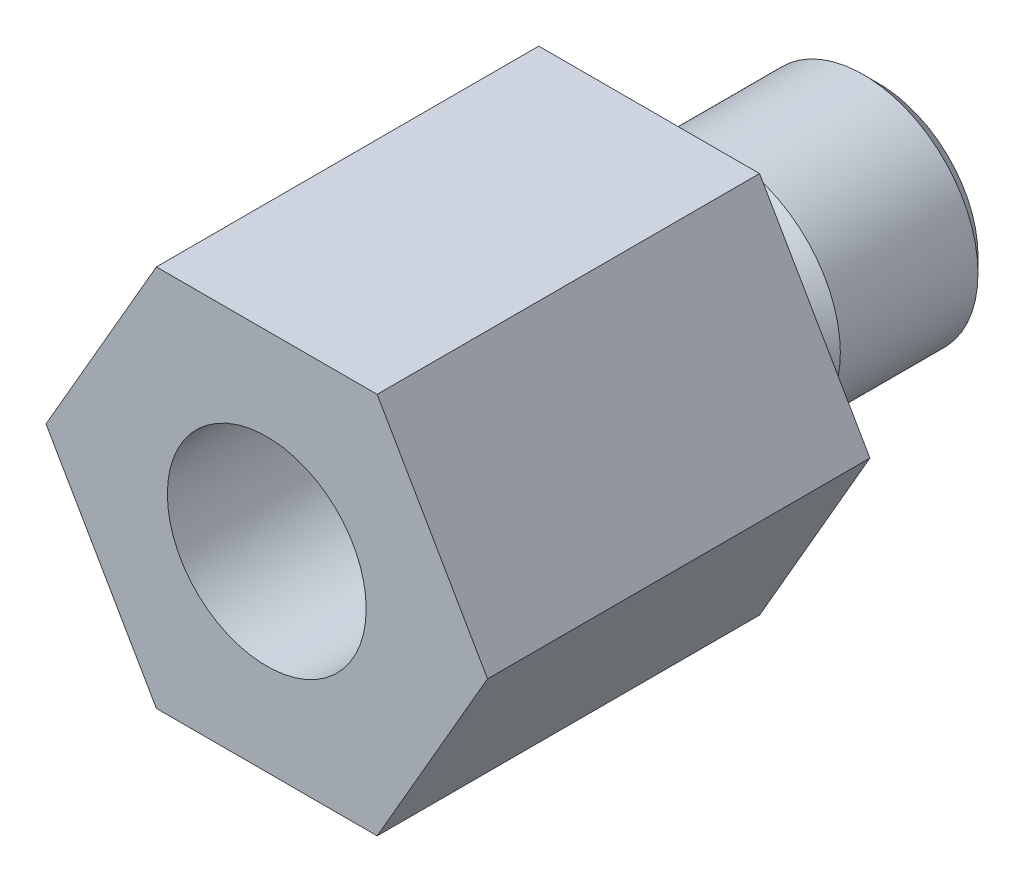
ISO-10303-21;
HEADER;
FILE_DESCRIPTION(('STEP AP214'),'2;1');
FILE_NAME('part.step','',(''),(''),'','','');
FILE_SCHEMA(('AUTOMOTIVE_DESIGN { 1 0 10303 214 1 1 1 1 }'));
ENDSEC;
DATA;
#1=APPLICATION_CONTEXT('core data for automotive mechanical design processes');
#2=APPLICATION_PROTOCOL_DEFINITION('international standard','automotive_design',2000,#1);
#3=PRODUCT_CONTEXT('',#1,'mechanical');
#4=PRODUCT('Part','Part','',(#3));
#5=PRODUCT_RELATED_PRODUCT_CATEGORY('part','',(#4));
#6=PRODUCT_DEFINITION_FORMATION('','',#4);
#7=PRODUCT_DEFINITION_CONTEXT('part definition',#1,'design');
#8=PRODUCT_DEFINITION('design','',#6,#7);
#9=PRODUCT_DEFINITION_SHAPE('','',#8);
#10=(LENGTH_UNIT() NAMED_UNIT(*) SI_UNIT(.MILLI.,.METRE.));
#11=(NAMED_UNIT(*) PLANE_ANGLE_UNIT() SI_UNIT($,.RADIAN.));
#12=(NAMED_UNIT(*) SI_UNIT($,.STERADIAN.) SOLID_ANGLE_UNIT());
#13=UNCERTAINTY_MEASURE_WITH_UNIT(LENGTH_MEASURE(1.E-05),#10,'distance_accuracy_value','');
#14=(GEOMETRIC_REPRESENTATION_CONTEXT(3) GLOBAL_UNCERTAINTY_ASSIGNED_CONTEXT((#13)) GLOBAL_UNIT_ASSIGNED_CONTEXT((#10,
#11,#12)) REPRESENTATION_CONTEXT('',''));
#15=CARTESIAN_POINT('',(0.,0.,0.));
#16=DIRECTION('',(0.,0.,1.));
#17=DIRECTION('',(1.,0.,0.));
#18=AXIS2_PLACEMENT_3D('',#15,#16,#17);
#19=CARTESIAN_POINT('',(1.44337567297406,2.5,0.));
#20=DIRECTION('',(0.,0.,1.));
#21=DIRECTION('',(1.,0.,0.));
#22=AXIS2_PLACEMENT_3D('',#19,#20,#21);
#23=PLANE('',#22);
#24=CARTESIAN_POINT('',(0.,0.,0.));
#25=DIRECTION('',(0.,0.,-1.));
#26=DIRECTION('',(-1.,0.,0.));
#27=AXIS2_PLACEMENT_3D('',#24,#25,#26);
#28=CIRCLE('',#27,1.4);
#29=CARTESIAN_POINT('',(-1.4,0.,0.));
#30=VERTEX_POINT('',#29);
#31=EDGE_CURVE('E320',#30,#30,#28,.T.);
#32=ORIENTED_EDGE('',*,*,#31,.F.);
#33=EDGE_LOOP('',(#32));
#34=FACE_BOUND('',#33,.T.);
#35=DIRECTION('',(-0.5,0.866025403784439,0.));
#36=VECTOR('',#35,1.);
#37=CARTESIAN_POINT('',(2.88675134594812,0.,0.));
#38=LINE('',#37,#36);
#39=CARTESIAN_POINT('',(2.88675134594812,0.,0.));
#40=VERTEX_POINT('',#39);
#41=CARTESIAN_POINT('',(1.44337567297406,2.5,0.));
#42=VERTEX_POINT('',#41);
#43=EDGE_CURVE('E92',#40,#42,#38,.T.);
#44=ORIENTED_EDGE('',*,*,#43,.F.);
#45=DIRECTION('',(0.5,0.866025403784439,0.));
#46=VECTOR('',#45,1.);
#47=CARTESIAN_POINT('',(1.44337567297405,-2.5,0.));
#48=LINE('',#47,#46);
#49=CARTESIAN_POINT('',(1.44337567297405,-2.5,0.));
#50=VERTEX_POINT('',#49);
#51=EDGE_CURVE('E121',#50,#40,#48,.T.);
#52=ORIENTED_EDGE('',*,*,#51,.F.);
#53=DIRECTION('',(1.,0.,0.));
#54=VECTOR('',#53,1.);
#55=CARTESIAN_POINT('',(-1.44337567297407,-2.5,0.));
#56=LINE('',#55,#54);
#57=CARTESIAN_POINT('',(-1.44337567297407,-2.5,0.));
#58=VERTEX_POINT('',#57);
#59=EDGE_CURVE('E119',#58,#50,#56,.T.);
#60=ORIENTED_EDGE('',*,*,#59,.F.);
#61=DIRECTION('',(0.5,-0.866025403784439,0.));
#62=VECTOR('',#61,1.);
#63=CARTESIAN_POINT('',(-2.88675134594813,0.,0.));
#64=LINE('',#63,#62);
#65=CARTESIAN_POINT('',(-2.88675134594813,0.,0.));
#66=VERTEX_POINT('',#65);
#67=EDGE_CURVE('E117',#66,#58,#64,.T.);
#68=ORIENTED_EDGE('',*,*,#67,.F.);
#69=DIRECTION('',(-0.5,-0.866025403784439,0.));
#70=VECTOR('',#69,1.);
#71=CARTESIAN_POINT('',(-1.44337567297407,2.5,0.));
#72=LINE('',#71,#70);
#73=CARTESIAN_POINT('',(-1.44337567297407,2.5,0.));
#74=VERTEX_POINT('',#73);
#75=EDGE_CURVE('E94',#74,#66,#72,.T.);
#76=ORIENTED_EDGE('',*,*,#75,.F.);
#77=DIRECTION('',(-1.,0.,0.));
#78=VECTOR('',#77,1.);
#79=CARTESIAN_POINT('',(1.44337567297406,2.5,0.));
#80=LINE('',#79,#78);
#81=EDGE_CURVE('E88',#42,#74,#80,.T.);
#82=ORIENTED_EDGE('',*,*,#81,.F.);
#83=EDGE_LOOP('',(#44,#52,#60,#68,#76,#82));
#84=FACE_BOUND('',#83,.T.);
#85=ADVANCED_FACE('F34',(#34,#84),#23,.F.);
#86=CARTESIAN_POINT('',(2.88675134594812,0.,5.));
#87=DIRECTION('',(-0.866025403784439,-0.5,0.));
#88=DIRECTION('',(0.5,-0.866025403784439,0.));
#89=AXIS2_PLACEMENT_3D('',#86,#87,#88);
#90=PLANE('',#89);
#91=ORIENTED_EDGE('',*,*,#43,.T.);
#92=DIRECTION('',(0.,0.,-1.));
#93=VECTOR('',#92,1.);
#94=CARTESIAN_POINT('',(1.44337567297406,2.5,5.));
#95=LINE('',#94,#93);
#96=CARTESIAN_POINT('',(1.44337567297406,2.5,5.));
#97=VERTEX_POINT('',#96);
#98=EDGE_CURVE('E100',#97,#42,#95,.T.);
#99=ORIENTED_EDGE('',*,*,#98,.F.);
#100=DIRECTION('',(-0.5,0.866025403784439,0.));
#101=VECTOR('',#100,1.);
#102=CARTESIAN_POINT('',(2.88675134594812,0.,5.));
#103=LINE('',#102,#101);
#104=CARTESIAN_POINT('',(2.88675134594812,0.,5.));
#105=VERTEX_POINT('',#104);
#106=EDGE_CURVE('E123',#105,#97,#103,.T.);
#107=ORIENTED_EDGE('',*,*,#106,.F.);
#108=DIRECTION('',(0.,0.,-1.));
#109=VECTOR('',#108,1.);
#110=CARTESIAN_POINT('',(2.88675134594812,0.,5.));
#111=LINE('',#110,#109);
#112=EDGE_CURVE('E108',#105,#40,#111,.T.);
#113=ORIENTED_EDGE('',*,*,#112,.T.);
#114=EDGE_LOOP('',(#91,#99,#107,#113));
#115=FACE_BOUND('',#114,.T.);
#116=ADVANCED_FACE('F36',(#115),#90,.F.);
#117=CARTESIAN_POINT('',(1.44337567297406,2.5,5.));
#118=DIRECTION('',(0.,-1.,0.));
#119=DIRECTION('',(0.,0.,-1.));
#120=AXIS2_PLACEMENT_3D('',#117,#118,#119);
#121=PLANE('',#120);
#122=ORIENTED_EDGE('',*,*,#81,.T.);
#123=DIRECTION('',(0.,0.,-1.));
#124=VECTOR('',#123,1.);
#125=CARTESIAN_POINT('',(-1.44337567297407,2.5,5.));
#126=LINE('',#125,#124);
#127=CARTESIAN_POINT('',(-1.44337567297407,2.5,5.));
#128=VERTEX_POINT('',#127);
#129=EDGE_CURVE('E105',#128,#74,#126,.T.);
#130=ORIENTED_EDGE('',*,*,#129,.F.);
#131=DIRECTION('',(-1.,0.,0.));
#132=VECTOR('',#131,1.);
#133=CARTESIAN_POINT('',(1.44337567297406,2.5,5.));
#134=LINE('',#133,#132);
#135=EDGE_CURVE('E102',#97,#128,#134,.T.);
#136=ORIENTED_EDGE('',*,*,#135,.F.);
#137=ORIENTED_EDGE('',*,*,#98,.T.);
#138=EDGE_LOOP('',(#122,#130,#136,#137));
#139=FACE_BOUND('',#138,.T.);
#140=ADVANCED_FACE('F101',(#139),#121,.F.);
#141=CARTESIAN_POINT('',(-1.44337567297407,2.5,5.));
#142=DIRECTION('',(0.866025403784439,-0.5,0.));
#143=DIRECTION('',(0.5,0.866025403784439,0.));
#144=AXIS2_PLACEMENT_3D('',#141,#142,#143);
#145=PLANE('',#144);
#146=ORIENTED_EDGE('',*,*,#75,.T.);
#147=DIRECTION('',(0.,0.,-1.));
#148=VECTOR('',#147,1.);
#149=CARTESIAN_POINT('',(-2.88675134594813,0.,5.));
#150=LINE('',#149,#148);
#151=CARTESIAN_POINT('',(-2.88675134594813,0.,5.));
#152=VERTEX_POINT('',#151);
#153=EDGE_CURVE('E139',#152,#66,#150,.T.);
#154=ORIENTED_EDGE('',*,*,#153,.F.);
#155=DIRECTION('',(-0.5,-0.866025403784439,0.));
#156=VECTOR('',#155,1.);
#157=CARTESIAN_POINT('',(-1.44337567297407,2.5,5.));
#158=LINE('',#157,#156);
#159=EDGE_CURVE('E126',#128,#152,#158,.T.);
#160=ORIENTED_EDGE('',*,*,#159,.F.);
#161=ORIENTED_EDGE('',*,*,#129,.T.);
#162=EDGE_LOOP('',(#146,#154,#160,#161));
#163=FACE_BOUND('',#162,.T.);
#164=ADVANCED_FACE('F187',(#163),#145,.F.);
#165=CARTESIAN_POINT('',(-2.88675134594813,0.,5.));
#166=DIRECTION('',(0.866025403784439,0.5,0.));
#167=DIRECTION('',(-0.5,0.866025403784439,0.));
#168=AXIS2_PLACEMENT_3D('',#165,#166,#167);
#169=PLANE('',#168);
#170=ORIENTED_EDGE('',*,*,#67,.T.);
#171=DIRECTION('',(0.,0.,-1.));
#172=VECTOR('',#171,1.);
#173=CARTESIAN_POINT('',(-1.44337567297407,-2.5,5.));
#174=LINE('',#173,#172);
#175=CARTESIAN_POINT('',(-1.44337567297407,-2.5,5.));
#176=VERTEX_POINT('',#175);
#177=EDGE_CURVE('E136',#176,#58,#174,.T.);
#178=ORIENTED_EDGE('',*,*,#177,.F.);
#179=DIRECTION('',(0.5,-0.866025403784439,0.));
#180=VECTOR('',#179,1.);
#181=CARTESIAN_POINT('',(-2.88675134594813,0.,5.));
#182=LINE('',#181,#180);
#183=EDGE_CURVE('E128',#152,#176,#182,.T.);
#184=ORIENTED_EDGE('',*,*,#183,.F.);
#185=ORIENTED_EDGE('',*,*,#153,.T.);
#186=EDGE_LOOP('',(#170,#178,#184,#185));
#187=FACE_BOUND('',#186,.T.);
#188=ADVANCED_FACE('F183',(#187),#169,.F.);
#189=CARTESIAN_POINT('',(-1.44337567297407,-2.5,5.));
#190=DIRECTION('',(0.,1.,0.));
#191=DIRECTION('',(0.,0.,1.));
#192=AXIS2_PLACEMENT_3D('',#189,#190,#191);
#193=PLANE('',#192);
#194=ORIENTED_EDGE('',*,*,#59,.T.);
#195=DIRECTION('',(0.,0.,-1.));
#196=VECTOR('',#195,1.);
#197=CARTESIAN_POINT('',(1.44337567297405,-2.5,5.));
#198=LINE('',#197,#196);
#199=CARTESIAN_POINT('',(1.44337567297405,-2.5,5.));
#200=VERTEX_POINT('',#199);
#201=EDGE_CURVE('E133',#200,#50,#198,.T.);
#202=ORIENTED_EDGE('',*,*,#201,.F.);
#203=DIRECTION('',(1.,0.,0.));
#204=VECTOR('',#203,1.);
#205=CARTESIAN_POINT('',(-1.44337567297407,-2.5,5.));
#206=LINE('',#205,#204);
#207=EDGE_CURVE('E55',#176,#200,#206,.T.);
#208=ORIENTED_EDGE('',*,*,#207,.F.);
#209=ORIENTED_EDGE('',*,*,#177,.T.);
#210=EDGE_LOOP('',(#194,#202,#208,#209));
#211=FACE_BOUND('',#210,.T.);
#212=ADVANCED_FACE('F179',(#211),#193,.F.);
#213=CARTESIAN_POINT('',(1.44337567297405,-2.5,5.));
#214=DIRECTION('',(-0.866025403784439,0.5,0.));
#215=DIRECTION('',(-0.5,-0.866025403784439,0.));
#216=AXIS2_PLACEMENT_3D('',#213,#214,#215);
#217=PLANE('',#216);
#218=ORIENTED_EDGE('',*,*,#51,.T.);
#219=ORIENTED_EDGE('',*,*,#112,.F.);
#220=DIRECTION('',(0.5,0.866025403784439,0.));
#221=VECTOR('',#220,1.);
#222=CARTESIAN_POINT('',(1.44337567297405,-2.5,5.));
#223=LINE('',#222,#221);
#224=EDGE_CURVE('E50',#200,#105,#223,.T.);
#225=ORIENTED_EDGE('',*,*,#224,.F.);
#226=ORIENTED_EDGE('',*,*,#201,.T.);
#227=EDGE_LOOP('',(#218,#219,#225,#226));
#228=FACE_BOUND('',#227,.T.);
#229=ADVANCED_FACE('F175',(#228),#217,.F.);
#230=CARTESIAN_POINT('',(1.44337567297406,2.5,5.));
#231=DIRECTION('',(0.,0.,1.));
#232=DIRECTION('',(1.,0.,0.));
#233=AXIS2_PLACEMENT_3D('',#230,#231,#232);
#234=PLANE('',#233);
#235=CARTESIAN_POINT('',(0.,0.,5.));
#236=DIRECTION('',(0.,0.,1.));
#237=DIRECTION('',(1.,0.,0.));
#238=AXIS2_PLACEMENT_3D('',#235,#236,#237);
#239=CIRCLE('',#238,1.3);
#240=CARTESIAN_POINT('',(1.3,0.,5.));
#241=VERTEX_POINT('',#240);
#242=EDGE_CURVE('E112',#241,#241,#239,.T.);
#243=ORIENTED_EDGE('',*,*,#242,.F.);
#244=EDGE_LOOP('',(#243));
#245=FACE_BOUND('',#244,.T.);
#246=ORIENTED_EDGE('',*,*,#106,.T.);
#247=ORIENTED_EDGE('',*,*,#135,.T.);
#248=ORIENTED_EDGE('',*,*,#159,.T.);
#249=ORIENTED_EDGE('',*,*,#183,.T.);
#250=ORIENTED_EDGE('',*,*,#207,.T.);
#251=ORIENTED_EDGE('',*,*,#224,.T.);
#252=EDGE_LOOP('',(#246,#247,#248,#249,#250,#251));
#253=FACE_BOUND('',#252,.T.);
#254=ADVANCED_FACE('F171',(#245,#253),#234,.T.);
#255=CARTESIAN_POINT('',(0.,0.,2.));
#256=DIRECTION('',(0.,0.,1.));
#257=DIRECTION('',(1.,0.,0.));
#258=AXIS2_PLACEMENT_3D('',#255,#256,#257);
#259=CYLINDRICAL_SURFACE('',#258,1.3);
#260=CARTESIAN_POINT('',(0.,0.,2.));
#261=DIRECTION('',(0.,0.,1.));
#262=DIRECTION('',(1.,0.,0.));
#263=AXIS2_PLACEMENT_3D('',#260,#261,#262);
#264=CIRCLE('',#263,1.3);
#265=CARTESIAN_POINT('',(1.3,0.,2.));
#266=VERTEX_POINT('',#265);
#267=EDGE_CURVE('E109',#266,#266,#264,.T.);
#268=ORIENTED_EDGE('',*,*,#267,.F.);
#269=EDGE_LOOP('',(#268));
#270=FACE_BOUND('',#269,.T.);
#271=ORIENTED_EDGE('',*,*,#242,.T.);
#272=EDGE_LOOP('',(#271));
#273=FACE_BOUND('',#272,.T.);
#274=ADVANCED_FACE('F174',(#270,#273),#259,.F.);
#275=CARTESIAN_POINT('',(0.,0.,2.));
#276=DIRECTION('',(0.,0.,1.));
#277=DIRECTION('',(1.,0.,0.));
#278=AXIS2_PLACEMENT_3D('',#275,#276,#277);
#279=PLANE('',#278);
#280=ORIENTED_EDGE('',*,*,#267,.T.);
#281=EDGE_LOOP('',(#280));
#282=FACE_BOUND('',#281,.T.);
#283=ADVANCED_FACE('F224',(#282),#279,.T.);
#284=CARTESIAN_POINT('',(0.,0.,-1.30477291531948));
#285=DIRECTION('',(0.,0.,-1.));
#286=DIRECTION('',(-1.,0.,0.));
#287=AXIS2_PLACEMENT_3D('',#284,#285,#286);
#288=CONICAL_SURFACE('',#287,1.80477291531947,0.785398163397447);
#289=CARTESIAN_POINT('',(0.,0.,-0.75857864376269));
#290=DIRECTION('',(0.,0.,-1.));
#291=DIRECTION('',(-1.,0.,0.));
#292=AXIS2_PLACEMENT_3D('',#289,#290,#291);
#293=CIRCLE('',#292,1.25857864376269);
#294=CARTESIAN_POINT('',(-1.25857864376269,0.,-0.75857864376269));
#295=VERTEX_POINT('',#294);
#296=EDGE_CURVE('E327',#295,#295,#293,.T.);
#297=ORIENTED_EDGE('',*,*,#296,.T.);
#298=EDGE_LOOP('',(#297));
#299=FACE_BOUND('',#298,.T.);
#300=CARTESIAN_POINT('',(0.,0.,-1.));
#301=DIRECTION('',(0.,0.,-1.));
#302=DIRECTION('',(-1.,0.,0.));
#303=AXIS2_PLACEMENT_3D('',#300,#301,#302);
#304=CIRCLE('',#303,1.5);
#305=CARTESIAN_POINT('',(-1.5,0.,-1.));
#306=VERTEX_POINT('',#305);
#307=EDGE_CURVE('E38',#306,#306,#304,.F.);
#308=ORIENTED_EDGE('',*,*,#307,.T.);
#309=EDGE_LOOP('',(#308));
#310=FACE_BOUND('',#309,.T.);
#311=ADVANCED_FACE('F231',(#299,#310),#288,.T.);
#312=CARTESIAN_POINT('',(0.,0.,-0.61715728752538));
#313=DIRECTION('',(0.,0.,-1.));
#314=DIRECTION('',(-1.,0.,0.));
#315=AXIS2_PLACEMENT_3D('',#312,#313,#314);
#316=TOROIDAL_SURFACE('',#315,1.4,0.2);
#317=CARTESIAN_POINT('',(0.,0.,-0.617157287525379));
#318=DIRECTION('',(0.,0.,-1.));
#319=DIRECTION('',(-1.,0.,0.));
#320=AXIS2_PLACEMENT_3D('',#317,#318,#319);
#321=CIRCLE('',#320,1.2);
#322=CARTESIAN_POINT('',(-1.2,0.,-0.617157287525379));
#323=VERTEX_POINT('',#322);
#324=EDGE_CURVE('E324',#323,#323,#321,.T.);
#325=ORIENTED_EDGE('',*,*,#324,.T.);
#326=EDGE_LOOP('',(#325));
#327=FACE_BOUND('',#326,.T.);
#328=ORIENTED_EDGE('',*,*,#296,.F.);
#329=EDGE_LOOP('',(#328));
#330=FACE_BOUND('',#329,.T.);
#331=ADVANCED_FACE('F239',(#327,#330),#316,.F.);
#332=CARTESIAN_POINT('',(0.,0.,-4.37484100897906));
#333=DIRECTION('',(0.,0.,-1.));
#334=DIRECTION('',(-1.,0.,0.));
#335=AXIS2_PLACEMENT_3D('',#332,#333,#334);
#336=CYLINDRICAL_SURFACE('',#335,1.2);
#337=CARTESIAN_POINT('',(0.,0.,-0.200000000000001));
#338=DIRECTION('',(0.,0.,-1.));
#339=DIRECTION('',(-1.,0.,0.));
#340=AXIS2_PLACEMENT_3D('',#337,#338,#339);
#341=CIRCLE('',#340,1.2);
#342=CARTESIAN_POINT('',(-1.2,0.,-0.200000000000001));
#343=VERTEX_POINT('',#342);
#344=EDGE_CURVE('E323',#343,#343,#341,.T.);
#345=ORIENTED_EDGE('',*,*,#344,.T.);
#346=EDGE_LOOP('',(#345));
#347=FACE_BOUND('',#346,.T.);
#348=ORIENTED_EDGE('',*,*,#324,.F.);
#349=EDGE_LOOP('',(#348));
#350=FACE_BOUND('',#349,.T.);
#351=ADVANCED_FACE('F247',(#347,#350),#336,.T.);
#352=CARTESIAN_POINT('',(0.,0.,-0.2));
#353=DIRECTION('',(0.,0.,-1.));
#354=DIRECTION('',(-1.,0.,0.));
#355=AXIS2_PLACEMENT_3D('',#352,#353,#354);
#356=TOROIDAL_SURFACE('',#355,1.4,0.2);
#357=ORIENTED_EDGE('',*,*,#31,.T.);
#358=EDGE_LOOP('',(#357));
#359=FACE_BOUND('',#358,.T.);
#360=ORIENTED_EDGE('',*,*,#344,.F.);
#361=EDGE_LOOP('',(#360));
#362=FACE_BOUND('',#361,.T.);
#363=ADVANCED_FACE('F159',(#359,#362),#356,.F.);
#364=CARTESIAN_POINT('',(0.,0.,-3.));
#365=DIRECTION('',(0.,0.,-1.));
#366=DIRECTION('',(-1.,0.,0.));
#367=AXIS2_PLACEMENT_3D('',#364,#365,#366);
#368=PLANE('',#367);
#369=CARTESIAN_POINT('',(0.,0.,-3.));
#370=DIRECTION('',(0.,0.,-1.));
#371=DIRECTION('',(-1.,0.,0.));
#372=AXIS2_PLACEMENT_3D('',#369,#370,#371);
#373=CIRCLE('',#372,1.3);
#374=CARTESIAN_POINT('',(-1.3,0.,-3.));
#375=VERTEX_POINT('',#374);
#376=EDGE_CURVE('E43',#375,#375,#373,.T.);
#377=ORIENTED_EDGE('',*,*,#376,.T.);
#378=EDGE_LOOP('',(#377));
#379=FACE_BOUND('',#378,.T.);
#380=ADVANCED_FACE('F146',(#379),#368,.T.);
#381=CARTESIAN_POINT('',(0.,0.,-3.));
#382=DIRECTION('',(0.,0.,1.));
#383=DIRECTION('',(1.,0.,0.));
#384=AXIS2_PLACEMENT_3D('',#381,#382,#383);
#385=CONICAL_SURFACE('',#384,1.3,0.785398163397446);
#386=CARTESIAN_POINT('',(0.,0.,-2.8));
#387=DIRECTION('',(0.,0.,-1.));
#388=DIRECTION('',(-1.,0.,0.));
#389=AXIS2_PLACEMENT_3D('',#386,#387,#388);
#390=CIRCLE('',#389,1.5);
#391=CARTESIAN_POINT('',(-1.5,0.,-2.8));
#392=VERTEX_POINT('',#391);
#393=EDGE_CURVE('E11',#392,#392,#390,.F.);
#394=ORIENTED_EDGE('',*,*,#393,.F.);
#395=EDGE_LOOP('',(#394));
#396=FACE_BOUND('',#395,.T.);
#397=ORIENTED_EDGE('',*,*,#376,.F.);
#398=EDGE_LOOP('',(#397));
#399=FACE_BOUND('',#398,.T.);
#400=ADVANCED_FACE('F148',(#396,#399),#385,.T.);
#401=CARTESIAN_POINT('',(0.,0.,-3.));
#402=DIRECTION('',(0.,0.,1.));
#403=DIRECTION('',(1.,0.,0.));
#404=AXIS2_PLACEMENT_3D('',#401,#402,#403);
#405=CYLINDRICAL_SURFACE('',#404,1.5);
#406=ORIENTED_EDGE('',*,*,#393,.T.);
#407=EDGE_LOOP('',(#406));
#408=FACE_BOUND('',#407,.T.);
#409=ORIENTED_EDGE('',*,*,#307,.F.);
#410=EDGE_LOOP('',(#409));
#411=FACE_BOUND('',#410,.T.);
#412=ADVANCED_FACE('F150',(#408,#411),#405,.T.);
#413=CLOSED_SHELL('',(#85,#116,#140,#164,#188,#212,#229,#254,#274,#283,#311,#331,#351,#363,#380,
#400,#412));
#414=MANIFOLD_SOLID_BREP('B2',#413);
#415=ADVANCED_BREP_SHAPE_REPRESENTATION('',(#18,#414),#14);
#416=SHAPE_DEFINITION_REPRESENTATION(#9,#415);
ENDSEC;
END-ISO-10303-21;
